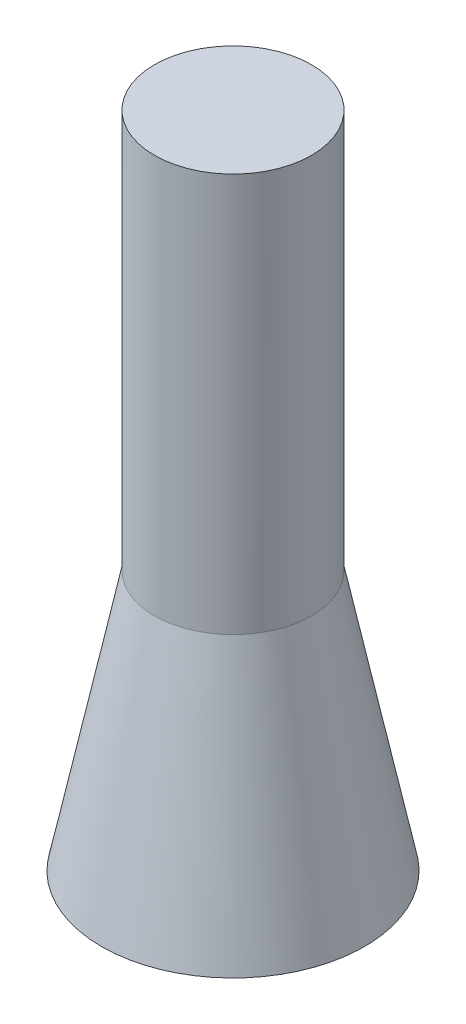
ISO-10303-21;
HEADER;
FILE_DESCRIPTION(('STEP AP214'),'2;1');
FILE_NAME('part.step','',(''),(''),'','','');
FILE_SCHEMA(('AUTOMOTIVE_DESIGN { 1 0 10303 214 1 1 1 1 }'));
ENDSEC;
DATA;
#1=APPLICATION_CONTEXT('core data for automotive mechanical design processes');
#2=APPLICATION_PROTOCOL_DEFINITION('international standard','automotive_design',2000,#1);
#3=PRODUCT_CONTEXT('',#1,'mechanical');
#4=PRODUCT('Part','Part','',(#3));
#5=PRODUCT_RELATED_PRODUCT_CATEGORY('part','',(#4));
#6=PRODUCT_DEFINITION_FORMATION('','',#4);
#7=PRODUCT_DEFINITION_CONTEXT('part definition',#1,'design');
#8=PRODUCT_DEFINITION('design','',#6,#7);
#9=PRODUCT_DEFINITION_SHAPE('','',#8);
#10=(LENGTH_UNIT() NAMED_UNIT(*) SI_UNIT(.MILLI.,.METRE.));
#11=(NAMED_UNIT(*) PLANE_ANGLE_UNIT() SI_UNIT($,.RADIAN.));
#12=(NAMED_UNIT(*) SI_UNIT($,.STERADIAN.) SOLID_ANGLE_UNIT());
#13=UNCERTAINTY_MEASURE_WITH_UNIT(LENGTH_MEASURE(1.E-05),#10,'distance_accuracy_value','');
#14=(GEOMETRIC_REPRESENTATION_CONTEXT(3) GLOBAL_UNCERTAINTY_ASSIGNED_CONTEXT((#13)) GLOBAL_UNIT_ASSIGNED_CONTEXT((#10,
#11,#12)) REPRESENTATION_CONTEXT('',''));
#15=CARTESIAN_POINT('',(0.,0.,0.));
#16=DIRECTION('',(0.,0.,1.));
#17=DIRECTION('',(1.,0.,0.));
#18=AXIS2_PLACEMENT_3D('',#15,#16,#17);
#19=CARTESIAN_POINT('',(0.,48.9897948556636,0.));
#20=DIRECTION('',(0.,-1.,0.));
#21=DIRECTION('',(0.,0.,-1.));
#22=AXIS2_PLACEMENT_3D('',#19,#20,#21);
#23=CONICAL_SURFACE('',#22,0.,0.201357920790331);
#24=CARTESIAN_POINT('',(0.,0.,0.));
#25=DIRECTION('',(0.,1.,0.));
#26=DIRECTION('',(0.,0.,1.));
#27=AXIS2_PLACEMENT_3D('',#24,#25,#26);
#28=CIRCLE('',#27,10.);
#29=CARTESIAN_POINT('',(0.,0.,10.));
#30=VERTEX_POINT('',#29);
#31=EDGE_CURVE('E10',#30,#30,#28,.T.);
#32=ORIENTED_EDGE('',*,*,#31,.T.);
#33=EDGE_LOOP('',(#32));
#34=FACE_BOUND('',#33,.T.);
#35=CARTESIAN_POINT('',(0.,19.747786306318,0.));
#36=DIRECTION('',(0.,-1.,0.));
#37=DIRECTION('',(0.,0.,-1.));
#38=AXIS2_PLACEMENT_3D('',#35,#36,#37);
#39=CIRCLE('',#38,5.969);
#40=CARTESIAN_POINT('',(0.,19.747786306318,-5.969));
#41=VERTEX_POINT('',#40);
#42=EDGE_CURVE('E37',#41,#41,#39,.T.);
#43=ORIENTED_EDGE('',*,*,#42,.T.);
#44=EDGE_LOOP('',(#43));
#45=FACE_BOUND('',#44,.T.);
#46=ADVANCED_FACE('F33',(#34,#45),#23,.T.);
#47=CARTESIAN_POINT('',(0.,0.,0.));
#48=DIRECTION('',(0.,-1.,0.));
#49=DIRECTION('',(0.,0.,-1.));
#50=AXIS2_PLACEMENT_3D('',#47,#48,#49);
#51=PLANE('',#50);
#52=CARTESIAN_POINT('',(0.,0.,0.));
#53=DIRECTION('',(0.,-1.,0.));
#54=DIRECTION('',(0.,0.,-1.));
#55=AXIS2_PLACEMENT_3D('',#52,#53,#54);
#56=CIRCLE('',#55,2.5);
#57=CARTESIAN_POINT('',(0.,0.,-2.5));
#58=VERTEX_POINT('',#57);
#59=EDGE_CURVE('E49',#58,#58,#56,.T.);
#60=ORIENTED_EDGE('',*,*,#59,.F.);
#61=EDGE_LOOP('',(#60));
#62=FACE_BOUND('',#61,.T.);
#63=ORIENTED_EDGE('',*,*,#31,.F.);
#64=EDGE_LOOP('',(#63));
#65=FACE_BOUND('',#64,.T.);
#66=ADVANCED_FACE('F35',(#62,#65),#51,.T.);
#67=CARTESIAN_POINT('',(0.,50.066,0.));
#68=DIRECTION('',(0.,-1.,0.));
#69=DIRECTION('',(0.,0.,-1.));
#70=AXIS2_PLACEMENT_3D('',#67,#68,#69);
#71=CYLINDRICAL_SURFACE('',#70,5.969);
#72=ORIENTED_EDGE('',*,*,#42,.F.);
#73=EDGE_LOOP('',(#72));
#74=FACE_BOUND('',#73,.T.);
#75=CARTESIAN_POINT('',(0.,50.066,0.));
#76=DIRECTION('',(0.,1.,0.));
#77=DIRECTION('',(0.,0.,1.));
#78=AXIS2_PLACEMENT_3D('',#75,#76,#77);
#79=CIRCLE('',#78,5.969);
#80=CARTESIAN_POINT('',(0.,50.066,5.969));
#81=VERTEX_POINT('',#80);
#82=EDGE_CURVE('E44',#81,#81,#79,.T.);
#83=ORIENTED_EDGE('',*,*,#82,.F.);
#84=EDGE_LOOP('',(#83));
#85=FACE_BOUND('',#84,.T.);
#86=ADVANCED_FACE('F66',(#74,#85),#71,.T.);
#87=CARTESIAN_POINT('',(0.,50.066,0.));
#88=DIRECTION('',(0.,1.,0.));
#89=DIRECTION('',(0.,0.,1.));
#90=AXIS2_PLACEMENT_3D('',#87,#88,#89);
#91=PLANE('',#90);
#92=ORIENTED_EDGE('',*,*,#82,.T.);
#93=EDGE_LOOP('',(#92));
#94=FACE_BOUND('',#93,.T.);
#95=ADVANCED_FACE('F60',(#94),#91,.T.);
#96=CARTESIAN_POINT('',(0.,20.,0.));
#97=DIRECTION('',(0.,-1.,0.));
#98=DIRECTION('',(0.,0.,-1.));
#99=AXIS2_PLACEMENT_3D('',#96,#97,#98);
#100=CYLINDRICAL_SURFACE('',#99,2.5);
#101=CARTESIAN_POINT('',(0.,20.,0.));
#102=DIRECTION('',(0.,-1.,0.));
#103=DIRECTION('',(0.,0.,-1.));
#104=AXIS2_PLACEMENT_3D('',#101,#102,#103);
#105=CIRCLE('',#104,2.5);
#106=CARTESIAN_POINT('',(0.,20.,-2.5));
#107=VERTEX_POINT('',#106);
#108=EDGE_CURVE('E48',#107,#107,#105,.T.);
#109=ORIENTED_EDGE('',*,*,#108,.F.);
#110=EDGE_LOOP('',(#109));
#111=FACE_BOUND('',#110,.T.);
#112=ORIENTED_EDGE('',*,*,#59,.T.);
#113=EDGE_LOOP('',(#112));
#114=FACE_BOUND('',#113,.T.);
#115=ADVANCED_FACE('F57',(#111,#114),#100,.F.);
#116=CARTESIAN_POINT('',(0.,20.,0.));
#117=DIRECTION('',(0.,-1.,0.));
#118=DIRECTION('',(0.,0.,-1.));
#119=AXIS2_PLACEMENT_3D('',#116,#117,#118);
#120=PLANE('',#119);
#121=ORIENTED_EDGE('',*,*,#108,.T.);
#122=EDGE_LOOP('',(#121));
#123=FACE_BOUND('',#122,.T.);
#124=ADVANCED_FACE('F55',(#123),#120,.T.);
#125=CLOSED_SHELL('',(#46,#66,#86,#95,#115,#124));
#126=MANIFOLD_SOLID_BREP('B2',#125);
#127=ADVANCED_BREP_SHAPE_REPRESENTATION('',(#18,#126),#14);
#128=SHAPE_DEFINITION_REPRESENTATION(#9,#127);
ENDSEC;
END-ISO-10303-21;
